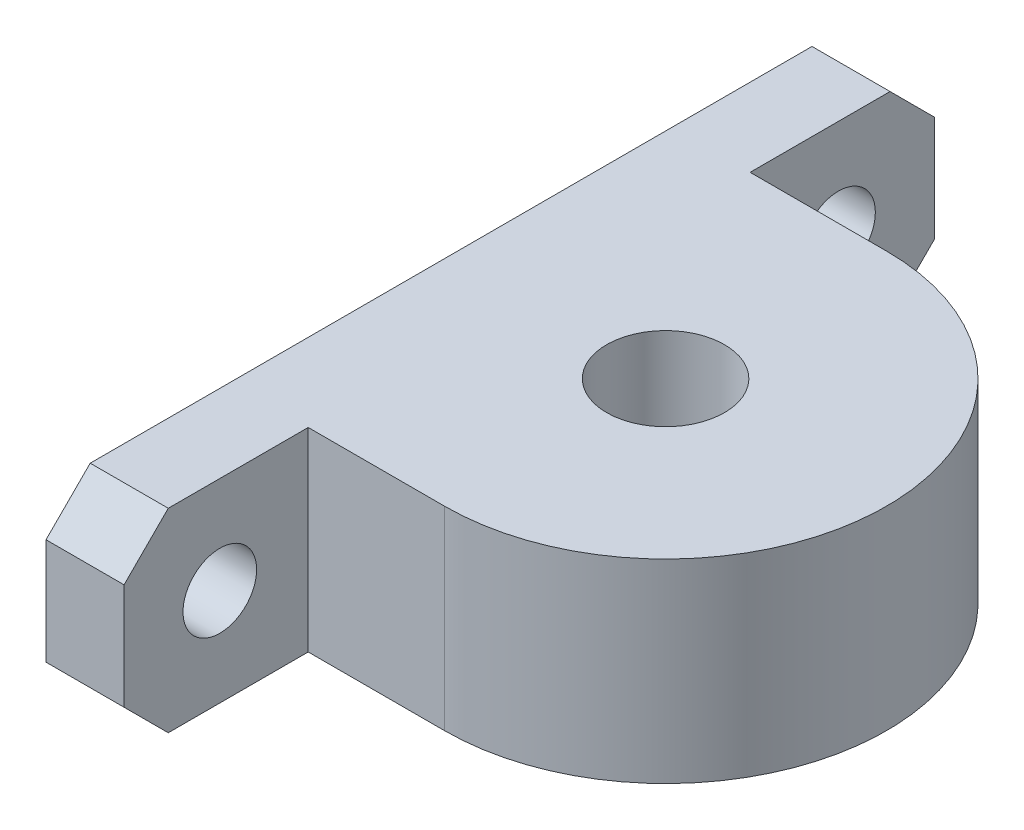
ISO-10303-21;
HEADER;
FILE_DESCRIPTION(('STEP AP214'),'2;1');
FILE_NAME('part.step','',(''),(''),'','','');
FILE_SCHEMA(('AUTOMOTIVE_DESIGN { 1 0 10303 214 1 1 1 1 }'));
ENDSEC;
DATA;
#1=APPLICATION_CONTEXT('core data for automotive mechanical design processes');
#2=APPLICATION_PROTOCOL_DEFINITION('international standard','automotive_design',2000,#1);
#3=PRODUCT_CONTEXT('',#1,'mechanical');
#4=PRODUCT('Part','Part','',(#3));
#5=PRODUCT_RELATED_PRODUCT_CATEGORY('part','',(#4));
#6=PRODUCT_DEFINITION_FORMATION('','',#4);
#7=PRODUCT_DEFINITION_CONTEXT('part definition',#1,'design');
#8=PRODUCT_DEFINITION('design','',#6,#7);
#9=PRODUCT_DEFINITION_SHAPE('','',#8);
#10=(LENGTH_UNIT() NAMED_UNIT(*) SI_UNIT(.MILLI.,.METRE.));
#11=(NAMED_UNIT(*) PLANE_ANGLE_UNIT() SI_UNIT($,.RADIAN.));
#12=(NAMED_UNIT(*) SI_UNIT($,.STERADIAN.) SOLID_ANGLE_UNIT());
#13=UNCERTAINTY_MEASURE_WITH_UNIT(LENGTH_MEASURE(1.E-05),#10,'distance_accuracy_value','');
#14=(GEOMETRIC_REPRESENTATION_CONTEXT(3) GLOBAL_UNCERTAINTY_ASSIGNED_CONTEXT((#13)) GLOBAL_UNIT_ASSIGNED_CONTEXT((#10,
#11,#12)) REPRESENTATION_CONTEXT('',''));
#15=CARTESIAN_POINT('',(0.,0.,0.));
#16=DIRECTION('',(0.,0.,1.));
#17=DIRECTION('',(1.,0.,0.));
#18=AXIS2_PLACEMENT_3D('',#15,#16,#17);
#19=CARTESIAN_POINT('',(0.,13.2,0.));
#20=DIRECTION('',(0.,1.,0.));
#21=DIRECTION('',(0.,0.,1.));
#22=AXIS2_PLACEMENT_3D('',#19,#20,#21);
#23=PLANE('',#22);
#24=DIRECTION('',(0.,0.,-1.));
#25=VECTOR('',#24,1.);
#26=CARTESIAN_POINT('',(-9.26,13.2,-27.5));
#27=LINE('',#26,#25);
#28=CARTESIAN_POINT('',(-9.25999999999999,13.2,-15.));
#29=VERTEX_POINT('',#28);
#30=CARTESIAN_POINT('',(-9.26,13.2,-24.5));
#31=VERTEX_POINT('',#30);
#32=EDGE_CURVE('E145',#29,#31,#27,.T.);
#33=ORIENTED_EDGE('',*,*,#32,.T.);
#34=DIRECTION('',(-1.,0.,0.));
#35=VECTOR('',#34,1.);
#36=CARTESIAN_POINT('',(-14.56,13.2,-24.5));
#37=LINE('',#36,#35);
#38=CARTESIAN_POINT('',(-14.56,13.2,-24.5));
#39=VERTEX_POINT('',#38);
#40=EDGE_CURVE('E163',#31,#39,#37,.T.);
#41=ORIENTED_EDGE('',*,*,#40,.T.);
#42=DIRECTION('',(0.,0.,1.));
#43=VECTOR('',#42,1.);
#44=CARTESIAN_POINT('',(-14.56,13.2,27.5));
#45=LINE('',#44,#43);
#46=CARTESIAN_POINT('',(-14.56,13.2,24.5));
#47=VERTEX_POINT('',#46);
#48=EDGE_CURVE('E247',#39,#47,#45,.T.);
#49=ORIENTED_EDGE('',*,*,#48,.T.);
#50=DIRECTION('',(1.,0.,0.));
#51=VECTOR('',#50,1.);
#52=CARTESIAN_POINT('',(-9.26,13.2,24.5));
#53=LINE('',#52,#51);
#54=CARTESIAN_POINT('',(-9.26,13.2,24.5));
#55=VERTEX_POINT('',#54);
#56=EDGE_CURVE('E160',#47,#55,#53,.T.);
#57=ORIENTED_EDGE('',*,*,#56,.T.);
#58=DIRECTION('',(0.,0.,-1.));
#59=VECTOR('',#58,1.);
#60=CARTESIAN_POINT('',(-9.26,13.2,27.5));
#61=LINE('',#60,#59);
#62=CARTESIAN_POINT('',(-9.25999999999999,13.2,15.));
#63=VERTEX_POINT('',#62);
#64=EDGE_CURVE('E245',#55,#63,#61,.T.);
#65=ORIENTED_EDGE('',*,*,#64,.T.);
#66=DIRECTION('',(1.,0.,0.));
#67=VECTOR('',#66,1.);
#68=CARTESIAN_POINT('',(0.,13.2,15.));
#69=LINE('',#68,#67);
#70=CARTESIAN_POINT('',(0.,13.2,15.));
#71=VERTEX_POINT('',#70);
#72=EDGE_CURVE('E151',#63,#71,#69,.T.);
#73=ORIENTED_EDGE('',*,*,#72,.T.);
#74=CARTESIAN_POINT('',(0.,13.2,0.));
#75=DIRECTION('',(0.,1.,0.));
#76=DIRECTION('',(0.,0.,1.));
#77=AXIS2_PLACEMENT_3D('',#74,#75,#76);
#78=CIRCLE('',#77,15.);
#79=CARTESIAN_POINT('',(0.,13.2,-15.));
#80=VERTEX_POINT('',#79);
#81=EDGE_CURVE('E146',#71,#80,#78,.T.);
#82=ORIENTED_EDGE('',*,*,#81,.T.);
#83=DIRECTION('',(-1.,0.,0.));
#84=VECTOR('',#83,1.);
#85=CARTESIAN_POINT('',(0.,13.2,-15.));
#86=LINE('',#85,#84);
#87=EDGE_CURVE('E134',#80,#29,#86,.T.);
#88=ORIENTED_EDGE('',*,*,#87,.T.);
#89=EDGE_LOOP('',(#33,#41,#49,#57,#65,#73,#82,#88));
#90=FACE_BOUND('',#89,.T.);
#91=CARTESIAN_POINT('',(0.,13.2,0.));
#92=DIRECTION('',(0.,1.,0.));
#93=DIRECTION('',(0.,0.,1.));
#94=AXIS2_PLACEMENT_3D('',#91,#92,#93);
#95=CIRCLE('',#94,4.);
#96=CARTESIAN_POINT('',(0.,13.2,4.));
#97=VERTEX_POINT('',#96);
#98=EDGE_CURVE('E251',#97,#97,#95,.T.);
#99=ORIENTED_EDGE('',*,*,#98,.F.);
#100=EDGE_LOOP('',(#99));
#101=FACE_BOUND('',#100,.T.);
#102=ADVANCED_FACE('F43',(#90,#101),#23,.T.);
#103=CARTESIAN_POINT('',(0.,0.,0.));
#104=DIRECTION('',(0.,1.,0.));
#105=DIRECTION('',(0.,0.,1.));
#106=AXIS2_PLACEMENT_3D('',#103,#104,#105);
#107=PLANE('',#106);
#108=DIRECTION('',(0.,0.,1.));
#109=VECTOR('',#108,1.);
#110=CARTESIAN_POINT('',(-14.56,0.,27.5));
#111=LINE('',#110,#109);
#112=CARTESIAN_POINT('',(-14.56,0.,-24.5));
#113=VERTEX_POINT('',#112);
#114=CARTESIAN_POINT('',(-14.56,0.,24.5));
#115=VERTEX_POINT('',#114);
#116=EDGE_CURVE('E231',#113,#115,#111,.T.);
#117=ORIENTED_EDGE('',*,*,#116,.F.);
#118=DIRECTION('',(1.,0.,0.));
#119=VECTOR('',#118,1.);
#120=CARTESIAN_POINT('',(0.,0.,-24.5));
#121=LINE('',#120,#119);
#122=CARTESIAN_POINT('',(-9.26,0.,-24.5));
#123=VERTEX_POINT('',#122);
#124=EDGE_CURVE('E190',#113,#123,#121,.T.);
#125=ORIENTED_EDGE('',*,*,#124,.T.);
#126=DIRECTION('',(0.,0.,-1.));
#127=VECTOR('',#126,1.);
#128=CARTESIAN_POINT('',(-9.26,0.,-27.5));
#129=LINE('',#128,#127);
#130=CARTESIAN_POINT('',(-9.25999999999999,0.,-15.));
#131=VERTEX_POINT('',#130);
#132=EDGE_CURVE('E238',#131,#123,#129,.T.);
#133=ORIENTED_EDGE('',*,*,#132,.F.);
#134=DIRECTION('',(-1.,0.,0.));
#135=VECTOR('',#134,1.);
#136=CARTESIAN_POINT('',(0.,0.,-15.));
#137=LINE('',#136,#135);
#138=CARTESIAN_POINT('',(0.,0.,-15.));
#139=VERTEX_POINT('',#138);
#140=EDGE_CURVE('E241',#139,#131,#137,.T.);
#141=ORIENTED_EDGE('',*,*,#140,.F.);
#142=CARTESIAN_POINT('',(0.,0.,0.));
#143=DIRECTION('',(0.,1.,0.));
#144=DIRECTION('',(0.,0.,1.));
#145=AXIS2_PLACEMENT_3D('',#142,#143,#144);
#146=CIRCLE('',#145,15.);
#147=CARTESIAN_POINT('',(0.,0.,15.));
#148=VERTEX_POINT('',#147);
#149=EDGE_CURVE('E159',#148,#139,#146,.T.);
#150=ORIENTED_EDGE('',*,*,#149,.F.);
#151=DIRECTION('',(1.,0.,0.));
#152=VECTOR('',#151,1.);
#153=CARTESIAN_POINT('',(0.,0.,15.));
#154=LINE('',#153,#152);
#155=CARTESIAN_POINT('',(-9.25999999999999,0.,15.));
#156=VERTEX_POINT('',#155);
#157=EDGE_CURVE('E155',#156,#148,#154,.T.);
#158=ORIENTED_EDGE('',*,*,#157,.F.);
#159=DIRECTION('',(0.,0.,-1.));
#160=VECTOR('',#159,1.);
#161=CARTESIAN_POINT('',(-9.26,0.,27.5));
#162=LINE('',#161,#160);
#163=CARTESIAN_POINT('',(-9.26,0.,24.5));
#164=VERTEX_POINT('',#163);
#165=EDGE_CURVE('E237',#164,#156,#162,.T.);
#166=ORIENTED_EDGE('',*,*,#165,.F.);
#167=DIRECTION('',(-1.,0.,0.));
#168=VECTOR('',#167,1.);
#169=CARTESIAN_POINT('',(0.,0.,24.5));
#170=LINE('',#169,#168);
#171=EDGE_CURVE('E188',#164,#115,#170,.T.);
#172=ORIENTED_EDGE('',*,*,#171,.T.);
#173=EDGE_LOOP('',(#117,#125,#133,#141,#150,#158,#166,#172));
#174=FACE_BOUND('',#173,.T.);
#175=CARTESIAN_POINT('',(0.,0.,0.));
#176=DIRECTION('',(0.,1.,0.));
#177=DIRECTION('',(0.,0.,1.));
#178=AXIS2_PLACEMENT_3D('',#175,#176,#177);
#179=CIRCLE('',#178,4.);
#180=CARTESIAN_POINT('',(0.,0.,4.));
#181=VERTEX_POINT('',#180);
#182=EDGE_CURVE('E257',#181,#181,#179,.T.);
#183=ORIENTED_EDGE('',*,*,#182,.T.);
#184=EDGE_LOOP('',(#183));
#185=FACE_BOUND('',#184,.T.);
#186=ADVANCED_FACE('F233',(#174,#185),#107,.F.);
#187=CARTESIAN_POINT('',(0.,13.2,0.));
#188=DIRECTION('',(0.,-1.,0.));
#189=DIRECTION('',(0.,0.,-1.));
#190=AXIS2_PLACEMENT_3D('',#187,#188,#189);
#191=CYLINDRICAL_SURFACE('',#190,15.);
#192=ORIENTED_EDGE('',*,*,#149,.T.);
#193=DIRECTION('',(0.,-1.,0.));
#194=VECTOR('',#193,1.);
#195=CARTESIAN_POINT('',(0.,13.2,-15.));
#196=LINE('',#195,#194);
#197=EDGE_CURVE('E138',#80,#139,#196,.T.);
#198=ORIENTED_EDGE('',*,*,#197,.F.);
#199=ORIENTED_EDGE('',*,*,#81,.F.);
#200=DIRECTION('',(0.,-1.,0.));
#201=VECTOR('',#200,1.);
#202=CARTESIAN_POINT('',(0.,13.2,15.));
#203=LINE('',#202,#201);
#204=EDGE_CURVE('E208',#71,#148,#203,.T.);
#205=ORIENTED_EDGE('',*,*,#204,.T.);
#206=EDGE_LOOP('',(#192,#198,#199,#205));
#207=FACE_BOUND('',#206,.T.);
#208=ADVANCED_FACE('F157',(#207),#191,.T.);
#209=CARTESIAN_POINT('',(0.,13.2,-15.));
#210=DIRECTION('',(0.,0.,1.));
#211=DIRECTION('',(1.,0.,0.));
#212=AXIS2_PLACEMENT_3D('',#209,#210,#211);
#213=PLANE('',#212);
#214=ORIENTED_EDGE('',*,*,#140,.T.);
#215=DIRECTION('',(0.,-1.,0.));
#216=VECTOR('',#215,1.);
#217=CARTESIAN_POINT('',(-9.25999999999999,13.2,-15.));
#218=LINE('',#217,#216);
#219=EDGE_CURVE('E141',#29,#131,#218,.T.);
#220=ORIENTED_EDGE('',*,*,#219,.F.);
#221=ORIENTED_EDGE('',*,*,#87,.F.);
#222=ORIENTED_EDGE('',*,*,#197,.T.);
#223=EDGE_LOOP('',(#214,#220,#221,#222));
#224=FACE_BOUND('',#223,.T.);
#225=ADVANCED_FACE('F136',(#224),#213,.F.);
#226=CARTESIAN_POINT('',(-9.26,13.2,-27.5));
#227=DIRECTION('',(-1.,0.,0.));
#228=DIRECTION('',(0.,0.,1.));
#229=AXIS2_PLACEMENT_3D('',#226,#227,#228);
#230=PLANE('',#229);
#231=CARTESIAN_POINT('',(-9.25999999999998,6.6,-21.));
#232=DIRECTION('',(1.,0.,0.));
#233=DIRECTION('',(0.,0.,-1.));
#234=AXIS2_PLACEMENT_3D('',#231,#232,#233);
#235=CIRCLE('',#234,2.5);
#236=CARTESIAN_POINT('',(-9.25999999999998,6.6,-23.5));
#237=VERTEX_POINT('',#236);
#238=EDGE_CURVE('E271',#237,#237,#235,.T.);
#239=ORIENTED_EDGE('',*,*,#238,.F.);
#240=EDGE_LOOP('',(#239));
#241=FACE_BOUND('',#240,.T.);
#242=DIRECTION('',(0.,-1.,0.));
#243=VECTOR('',#242,1.);
#244=CARTESIAN_POINT('',(-9.26,13.2,-27.5));
#245=LINE('',#244,#243);
#246=CARTESIAN_POINT('',(-9.26,10.2,-27.5));
#247=VERTEX_POINT('',#246);
#248=CARTESIAN_POINT('',(-9.26,3.00000000000001,-27.5));
#249=VERTEX_POINT('',#248);
#250=EDGE_CURVE('E165',#247,#249,#245,.T.);
#251=ORIENTED_EDGE('',*,*,#250,.F.);
#252=DIRECTION('',(0.,0.707106781186548,0.707106781186547));
#253=VECTOR('',#252,1.);
#254=CARTESIAN_POINT('',(-9.26,13.2,-24.5));
#255=LINE('',#254,#253);
#256=EDGE_CURVE('E186',#247,#31,#255,.T.);
#257=ORIENTED_EDGE('',*,*,#256,.T.);
#258=ORIENTED_EDGE('',*,*,#32,.F.);
#259=ORIENTED_EDGE('',*,*,#219,.T.);
#260=ORIENTED_EDGE('',*,*,#132,.T.);
#261=DIRECTION('',(0.,-0.707106781186546,0.707106781186549));
#262=VECTOR('',#261,1.);
#263=CARTESIAN_POINT('',(-9.26,3.00000000000001,-27.5));
#264=LINE('',#263,#262);
#265=EDGE_CURVE('E184',#123,#249,#264,.F.);
#266=ORIENTED_EDGE('',*,*,#265,.T.);
#267=EDGE_LOOP('',(#251,#257,#258,#259,#260,#266));
#268=FACE_BOUND('',#267,.T.);
#269=ADVANCED_FACE('F252',(#241,#268),#230,.F.);
#270=CARTESIAN_POINT('',(-14.56,13.2,-27.5));
#271=DIRECTION('',(0.,0.,1.));
#272=DIRECTION('',(1.,0.,0.));
#273=AXIS2_PLACEMENT_3D('',#270,#271,#272);
#274=PLANE('',#273);
#275=DIRECTION('',(0.,-1.,0.));
#276=VECTOR('',#275,1.);
#277=CARTESIAN_POINT('',(-14.56,13.2,-27.5));
#278=LINE('',#277,#276);
#279=CARTESIAN_POINT('',(-14.56,10.2,-27.5));
#280=VERTEX_POINT('',#279);
#281=CARTESIAN_POINT('',(-14.56,3.00000000000001,-27.5));
#282=VERTEX_POINT('',#281);
#283=EDGE_CURVE('E205',#280,#282,#278,.T.);
#284=ORIENTED_EDGE('',*,*,#283,.F.);
#285=DIRECTION('',(1.,0.,0.));
#286=VECTOR('',#285,1.);
#287=CARTESIAN_POINT('',(-9.26,10.2,-27.5));
#288=LINE('',#287,#286);
#289=EDGE_CURVE('E182',#280,#247,#288,.T.);
#290=ORIENTED_EDGE('',*,*,#289,.T.);
#291=ORIENTED_EDGE('',*,*,#250,.T.);
#292=DIRECTION('',(-1.,0.,0.));
#293=VECTOR('',#292,1.);
#294=CARTESIAN_POINT('',(-14.56,3.00000000000001,-27.5));
#295=LINE('',#294,#293);
#296=EDGE_CURVE('E179',#249,#282,#295,.T.);
#297=ORIENTED_EDGE('',*,*,#296,.T.);
#298=EDGE_LOOP('',(#284,#290,#291,#297));
#299=FACE_BOUND('',#298,.T.);
#300=ADVANCED_FACE('F218',(#299),#274,.F.);
#301=CARTESIAN_POINT('',(-14.56,13.2,27.5));
#302=DIRECTION('',(1.,0.,0.));
#303=DIRECTION('',(0.,0.,-1.));
#304=AXIS2_PLACEMENT_3D('',#301,#302,#303);
#305=PLANE('',#304);
#306=CARTESIAN_POINT('',(-14.56,6.6,-21.));
#307=DIRECTION('',(1.,0.,0.));
#308=DIRECTION('',(0.,0.,-1.));
#309=AXIS2_PLACEMENT_3D('',#306,#307,#308);
#310=CIRCLE('',#309,2.5);
#311=CARTESIAN_POINT('',(-14.56,6.6,-23.5));
#312=VERTEX_POINT('',#311);
#313=EDGE_CURVE('E268',#312,#312,#310,.T.);
#314=ORIENTED_EDGE('',*,*,#313,.T.);
#315=EDGE_LOOP('',(#314));
#316=FACE_BOUND('',#315,.T.);
#317=CARTESIAN_POINT('',(-14.56,6.6,21.));
#318=DIRECTION('',(1.,0.,0.));
#319=DIRECTION('',(0.,0.,-1.));
#320=AXIS2_PLACEMENT_3D('',#317,#318,#319);
#321=CIRCLE('',#320,2.5);
#322=CARTESIAN_POINT('',(-14.56,6.6,18.5));
#323=VERTEX_POINT('',#322);
#324=EDGE_CURVE('E260',#323,#323,#321,.T.);
#325=ORIENTED_EDGE('',*,*,#324,.T.);
#326=EDGE_LOOP('',(#325));
#327=FACE_BOUND('',#326,.T.);
#328=ORIENTED_EDGE('',*,*,#48,.F.);
#329=DIRECTION('',(0.,-0.707106781186548,-0.707106781186547));
#330=VECTOR('',#329,1.);
#331=CARTESIAN_POINT('',(-14.56,13.2,-24.5));
#332=LINE('',#331,#330);
#333=EDGE_CURVE('E177',#39,#280,#332,.T.);
#334=ORIENTED_EDGE('',*,*,#333,.T.);
#335=ORIENTED_EDGE('',*,*,#283,.T.);
#336=DIRECTION('',(0.,0.707106781186546,-0.707106781186549));
#337=VECTOR('',#336,1.);
#338=CARTESIAN_POINT('',(-14.56,3.00000000000001,-27.5));
#339=LINE('',#338,#337);
#340=EDGE_CURVE('E175',#282,#113,#339,.F.);
#341=ORIENTED_EDGE('',*,*,#340,.T.);
#342=ORIENTED_EDGE('',*,*,#116,.T.);
#343=DIRECTION('',(0.,-0.707106781186546,-0.707106781186549));
#344=VECTOR('',#343,1.);
#345=CARTESIAN_POINT('',(-14.56,3.00000000000001,27.5));
#346=LINE('',#345,#344);
#347=CARTESIAN_POINT('',(-14.56,3.00000000000001,27.5));
#348=VERTEX_POINT('',#347);
#349=EDGE_CURVE('E171',#115,#348,#346,.F.);
#350=ORIENTED_EDGE('',*,*,#349,.T.);
#351=DIRECTION('',(0.,-1.,0.));
#352=VECTOR('',#351,1.);
#353=CARTESIAN_POINT('',(-14.56,13.2,27.5));
#354=LINE('',#353,#352);
#355=CARTESIAN_POINT('',(-14.56,10.2,27.5));
#356=VERTEX_POINT('',#355);
#357=EDGE_CURVE('E199',#356,#348,#354,.T.);
#358=ORIENTED_EDGE('',*,*,#357,.F.);
#359=DIRECTION('',(0.,0.707106781186548,-0.707106781186547));
#360=VECTOR('',#359,1.);
#361=CARTESIAN_POINT('',(-14.56,13.2,24.5));
#362=LINE('',#361,#360);
#363=EDGE_CURVE('E173',#356,#47,#362,.T.);
#364=ORIENTED_EDGE('',*,*,#363,.T.);
#365=EDGE_LOOP('',(#328,#334,#335,#341,#342,#350,#358,#364));
#366=FACE_BOUND('',#365,.T.);
#367=ADVANCED_FACE('F230',(#316,#327,#366),#305,.F.);
#368=CARTESIAN_POINT('',(-14.56,13.2,27.5));
#369=DIRECTION('',(0.,0.,-1.));
#370=DIRECTION('',(-1.,0.,0.));
#371=AXIS2_PLACEMENT_3D('',#368,#369,#370);
#372=PLANE('',#371);
#373=DIRECTION('',(0.,-1.,0.));
#374=VECTOR('',#373,1.);
#375=CARTESIAN_POINT('',(-9.26,13.2,27.5));
#376=LINE('',#375,#374);
#377=CARTESIAN_POINT('',(-9.26,10.2,27.5));
#378=VERTEX_POINT('',#377);
#379=CARTESIAN_POINT('',(-9.26,3.00000000000001,27.5));
#380=VERTEX_POINT('',#379);
#381=EDGE_CURVE('E196',#378,#380,#376,.T.);
#382=ORIENTED_EDGE('',*,*,#381,.F.);
#383=DIRECTION('',(-1.,0.,0.));
#384=VECTOR('',#383,1.);
#385=CARTESIAN_POINT('',(-14.56,10.2,27.5));
#386=LINE('',#385,#384);
#387=EDGE_CURVE('E11',#378,#356,#386,.T.);
#388=ORIENTED_EDGE('',*,*,#387,.T.);
#389=ORIENTED_EDGE('',*,*,#357,.T.);
#390=DIRECTION('',(1.,0.,0.));
#391=VECTOR('',#390,1.);
#392=CARTESIAN_POINT('',(-14.56,3.00000000000001,27.5));
#393=LINE('',#392,#391);
#394=EDGE_CURVE('E52',#348,#380,#393,.T.);
#395=ORIENTED_EDGE('',*,*,#394,.T.);
#396=EDGE_LOOP('',(#382,#388,#389,#395));
#397=FACE_BOUND('',#396,.T.);
#398=ADVANCED_FACE('F195',(#397),#372,.F.);
#399=CARTESIAN_POINT('',(-9.26,13.2,27.5));
#400=DIRECTION('',(-1.,0.,0.));
#401=DIRECTION('',(0.,0.,1.));
#402=AXIS2_PLACEMENT_3D('',#399,#400,#401);
#403=PLANE('',#402);
#404=CARTESIAN_POINT('',(-9.25999999999999,6.6,21.));
#405=DIRECTION('',(1.,0.,0.));
#406=DIRECTION('',(0.,0.,-1.));
#407=AXIS2_PLACEMENT_3D('',#404,#405,#406);
#408=CIRCLE('',#407,2.5);
#409=CARTESIAN_POINT('',(-9.25999999999999,6.6,18.5));
#410=VERTEX_POINT('',#409);
#411=EDGE_CURVE('E265',#410,#410,#408,.T.);
#412=ORIENTED_EDGE('',*,*,#411,.F.);
#413=EDGE_LOOP('',(#412));
#414=FACE_BOUND('',#413,.T.);
#415=ORIENTED_EDGE('',*,*,#64,.F.);
#416=DIRECTION('',(0.,-0.707106781186548,0.707106781186547));
#417=VECTOR('',#416,1.);
#418=CARTESIAN_POINT('',(-9.26,13.2,24.5));
#419=LINE('',#418,#417);
#420=EDGE_CURVE('E67',#55,#378,#419,.T.);
#421=ORIENTED_EDGE('',*,*,#420,.T.);
#422=ORIENTED_EDGE('',*,*,#381,.T.);
#423=DIRECTION('',(0.,0.707106781186546,0.707106781186549));
#424=VECTOR('',#423,1.);
#425=CARTESIAN_POINT('',(-9.26,3.00000000000001,27.5));
#426=LINE('',#425,#424);
#427=EDGE_CURVE('E59',#380,#164,#426,.F.);
#428=ORIENTED_EDGE('',*,*,#427,.T.);
#429=ORIENTED_EDGE('',*,*,#165,.T.);
#430=DIRECTION('',(0.,-1.,0.));
#431=VECTOR('',#430,1.);
#432=CARTESIAN_POINT('',(-9.25999999999999,13.2,15.));
#433=LINE('',#432,#431);
#434=EDGE_CURVE('E203',#63,#156,#433,.T.);
#435=ORIENTED_EDGE('',*,*,#434,.F.);
#436=EDGE_LOOP('',(#415,#421,#422,#428,#429,#435));
#437=FACE_BOUND('',#436,.T.);
#438=ADVANCED_FACE('F201',(#414,#437),#403,.F.);
#439=CARTESIAN_POINT('',(0.,13.2,15.));
#440=DIRECTION('',(0.,0.,-1.));
#441=DIRECTION('',(-1.,0.,0.));
#442=AXIS2_PLACEMENT_3D('',#439,#440,#441);
#443=PLANE('',#442);
#444=ORIENTED_EDGE('',*,*,#157,.T.);
#445=ORIENTED_EDGE('',*,*,#204,.F.);
#446=ORIENTED_EDGE('',*,*,#72,.F.);
#447=ORIENTED_EDGE('',*,*,#434,.T.);
#448=EDGE_LOOP('',(#444,#445,#446,#447));
#449=FACE_BOUND('',#448,.T.);
#450=ADVANCED_FACE('F296',(#449),#443,.F.);
#451=CARTESIAN_POINT('',(0.,13.2,0.));
#452=DIRECTION('',(0.,-1.,0.));
#453=DIRECTION('',(0.,0.,-1.));
#454=AXIS2_PLACEMENT_3D('',#451,#452,#453);
#455=CYLINDRICAL_SURFACE('',#454,4.);
#456=ORIENTED_EDGE('',*,*,#98,.T.);
#457=EDGE_LOOP('',(#456));
#458=FACE_BOUND('',#457,.T.);
#459=ORIENTED_EDGE('',*,*,#182,.F.);
#460=EDGE_LOOP('',(#459));
#461=FACE_BOUND('',#460,.T.);
#462=ADVANCED_FACE('F293',(#458,#461),#455,.F.);
#463=CARTESIAN_POINT('',(-9.25999999999999,6.6,21.));
#464=DIRECTION('',(1.,0.,0.));
#465=DIRECTION('',(0.,0.,-1.));
#466=AXIS2_PLACEMENT_3D('',#463,#464,#465);
#467=CYLINDRICAL_SURFACE('',#466,2.5);
#468=ORIENTED_EDGE('',*,*,#324,.F.);
#469=EDGE_LOOP('',(#468));
#470=FACE_BOUND('',#469,.T.);
#471=ORIENTED_EDGE('',*,*,#411,.T.);
#472=EDGE_LOOP('',(#471));
#473=FACE_BOUND('',#472,.T.);
#474=ADVANCED_FACE('F313',(#470,#473),#467,.F.);
#475=CARTESIAN_POINT('',(-9.25999999999998,6.6,-21.));
#476=DIRECTION('',(1.,0.,0.));
#477=DIRECTION('',(0.,0.,-1.));
#478=AXIS2_PLACEMENT_3D('',#475,#476,#477);
#479=CYLINDRICAL_SURFACE('',#478,2.5);
#480=ORIENTED_EDGE('',*,*,#313,.F.);
#481=EDGE_LOOP('',(#480));
#482=FACE_BOUND('',#481,.T.);
#483=ORIENTED_EDGE('',*,*,#238,.T.);
#484=EDGE_LOOP('',(#483));
#485=FACE_BOUND('',#484,.T.);
#486=ADVANCED_FACE('F275',(#482,#485),#479,.F.);
#487=CARTESIAN_POINT('',(0.,13.2,-24.5));
#488=DIRECTION('',(0.,0.707106781186547,-0.707106781186548));
#489=DIRECTION('',(1.,0.,0.));
#490=AXIS2_PLACEMENT_3D('',#487,#488,#489);
#491=PLANE('',#490);
#492=ORIENTED_EDGE('',*,*,#256,.F.);
#493=ORIENTED_EDGE('',*,*,#289,.F.);
#494=ORIENTED_EDGE('',*,*,#333,.F.);
#495=ORIENTED_EDGE('',*,*,#40,.F.);
#496=EDGE_LOOP('',(#492,#493,#494,#495));
#497=FACE_BOUND('',#496,.T.);
#498=ADVANCED_FACE('F320',(#497),#491,.T.);
#499=CARTESIAN_POINT('',(-14.56,3.00000000000001,-27.5));
#500=DIRECTION('',(0.,0.707106781186549,0.707106781186546));
#501=DIRECTION('',(-1.,0.,0.));
#502=AXIS2_PLACEMENT_3D('',#499,#500,#501);
#503=PLANE('',#502);
#504=ORIENTED_EDGE('',*,*,#265,.F.);
#505=ORIENTED_EDGE('',*,*,#124,.F.);
#506=ORIENTED_EDGE('',*,*,#340,.F.);
#507=ORIENTED_EDGE('',*,*,#296,.F.);
#508=EDGE_LOOP('',(#504,#505,#506,#507));
#509=FACE_BOUND('',#508,.T.);
#510=ADVANCED_FACE('F224',(#509),#503,.F.);
#511=CARTESIAN_POINT('',(0.,13.2,24.5));
#512=DIRECTION('',(0.,0.707106781186547,0.707106781186548));
#513=DIRECTION('',(-1.,0.,0.));
#514=AXIS2_PLACEMENT_3D('',#511,#512,#513);
#515=PLANE('',#514);
#516=ORIENTED_EDGE('',*,*,#363,.F.);
#517=ORIENTED_EDGE('',*,*,#387,.F.);
#518=ORIENTED_EDGE('',*,*,#420,.F.);
#519=ORIENTED_EDGE('',*,*,#56,.F.);
#520=EDGE_LOOP('',(#516,#517,#518,#519));
#521=FACE_BOUND('',#520,.T.);
#522=ADVANCED_FACE('F408',(#521),#515,.T.);
#523=CARTESIAN_POINT('',(-14.56,3.00000000000001,27.5));
#524=DIRECTION('',(0.,0.707106781186549,-0.707106781186546));
#525=DIRECTION('',(1.,0.,0.));
#526=AXIS2_PLACEMENT_3D('',#523,#524,#525);
#527=PLANE('',#526);
#528=ORIENTED_EDGE('',*,*,#349,.F.);
#529=ORIENTED_EDGE('',*,*,#171,.F.);
#530=ORIENTED_EDGE('',*,*,#427,.F.);
#531=ORIENTED_EDGE('',*,*,#394,.F.);
#532=EDGE_LOOP('',(#528,#529,#530,#531));
#533=FACE_BOUND('',#532,.T.);
#534=ADVANCED_FACE('F46',(#533),#527,.F.);
#535=CLOSED_SHELL('',(#102,#186,#208,#225,#269,#300,#367,#398,#438,#450,#462,#474,#486,#498,
#510,#522,#534));
#536=MANIFOLD_SOLID_BREP('B2',#535);
#537=ADVANCED_BREP_SHAPE_REPRESENTATION('',(#18,#536),#14);
#538=SHAPE_DEFINITION_REPRESENTATION(#9,#537);
ENDSEC;
END-ISO-10303-21;
